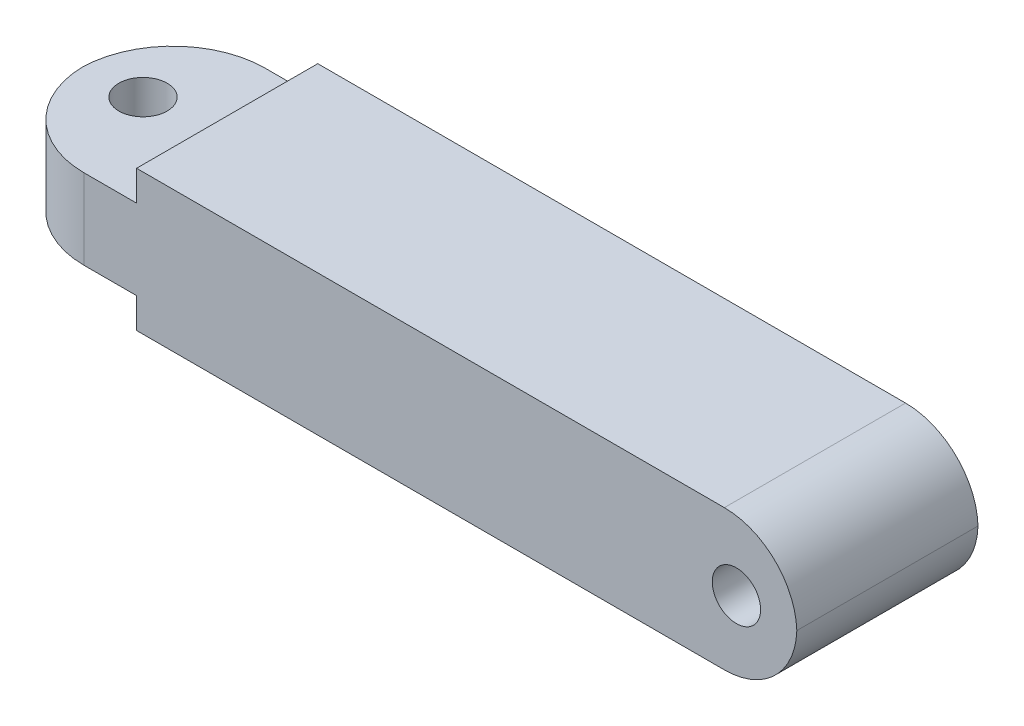
ISO-10303-21;
HEADER;
FILE_DESCRIPTION(('STEP AP214'),'2;1');
FILE_NAME('part.step','',(''),(''),'','','');
FILE_SCHEMA(('AUTOMOTIVE_DESIGN { 1 0 10303 214 1 1 1 1 }'));
ENDSEC;
DATA;
#1=APPLICATION_CONTEXT('core data for automotive mechanical design processes');
#2=APPLICATION_PROTOCOL_DEFINITION('international standard','automotive_design',2000,#1);
#3=PRODUCT_CONTEXT('',#1,'mechanical');
#4=PRODUCT('Part','Part','',(#3));
#5=PRODUCT_RELATED_PRODUCT_CATEGORY('part','',(#4));
#6=PRODUCT_DEFINITION_FORMATION('','',#4);
#7=PRODUCT_DEFINITION_CONTEXT('part definition',#1,'design');
#8=PRODUCT_DEFINITION('design','',#6,#7);
#9=PRODUCT_DEFINITION_SHAPE('','',#8);
#10=(LENGTH_UNIT() NAMED_UNIT(*) SI_UNIT(.MILLI.,.METRE.));
#11=(NAMED_UNIT(*) PLANE_ANGLE_UNIT() SI_UNIT($,.RADIAN.));
#12=(NAMED_UNIT(*) SI_UNIT($,.STERADIAN.) SOLID_ANGLE_UNIT());
#13=UNCERTAINTY_MEASURE_WITH_UNIT(LENGTH_MEASURE(1.E-05),#10,'distance_accuracy_value','');
#14=(GEOMETRIC_REPRESENTATION_CONTEXT(3) GLOBAL_UNCERTAINTY_ASSIGNED_CONTEXT((#13)) GLOBAL_UNIT_ASSIGNED_CONTEXT((#10,
#11,#12)) REPRESENTATION_CONTEXT('',''));
#15=CARTESIAN_POINT('',(0.,0.,0.));
#16=DIRECTION('',(0.,0.,1.));
#17=DIRECTION('',(1.,0.,0.));
#18=AXIS2_PLACEMENT_3D('',#15,#16,#17);
#19=CARTESIAN_POINT('',(-26.9163309618728,5.4095,8.3575723830735));
#20=DIRECTION('',(0.,0.,-1.));
#21=DIRECTION('',(-1.,0.,0.));
#22=AXIS2_PLACEMENT_3D('',#19,#20,#21);
#23=PLANE('',#22);
#24=CARTESIAN_POINT('',(30.4310635687302,0.,8.3575723830735));
#25=DIRECTION('',(0.,0.,1.));
#26=DIRECTION('',(1.,0.,0.));
#27=AXIS2_PLACEMENT_3D('',#24,#25,#26);
#28=CIRCLE('',#27,1.86);
#29=CARTESIAN_POINT('',(32.2910635687302,0.,8.3575723830735));
#30=VERTEX_POINT('',#29);
#31=EDGE_CURVE('E340',#30,#30,#28,.T.);
#32=ORIENTED_EDGE('',*,*,#31,.F.);
#33=EDGE_LOOP('',(#32));
#34=FACE_BOUND('',#33,.T.);
#35=DIRECTION('',(0.,-1.,0.));
#36=VECTOR('',#35,1.);
#37=CARTESIAN_POINT('',(-15.7546459801643,-3.0845,8.3575723830735));
#38=LINE('',#37,#36);
#39=CARTESIAN_POINT('',(-15.7546459801643,-3.0845,8.3575723830735));
#40=VERTEX_POINT('',#39);
#41=CARTESIAN_POINT('',(-15.7546459801643,-5.4095,8.3575723830735));
#42=VERTEX_POINT('',#41);
#43=EDGE_CURVE('E111',#40,#42,#38,.T.);
#44=ORIENTED_EDGE('',*,*,#43,.T.);
#45=DIRECTION('',(1.,0.,0.));
#46=VECTOR('',#45,1.);
#47=CARTESIAN_POINT('',(-26.9163309618728,-5.4095,8.3575723830735));
#48=LINE('',#47,#46);
#49=CARTESIAN_POINT('',(29.5036690381272,-5.4095,8.3575723830735));
#50=VERTEX_POINT('',#49);
#51=EDGE_CURVE('E162',#42,#50,#48,.T.);
#52=ORIENTED_EDGE('',*,*,#51,.T.);
#53=CARTESIAN_POINT('',(29.5036690381272,0.170500000000001,8.3575723830735));
#54=DIRECTION('',(0.,0.,-1.));
#55=DIRECTION('',(-1.,0.,0.));
#56=AXIS2_PLACEMENT_3D('',#53,#54,#55);
#57=CIRCLE('',#56,5.58);
#58=CARTESIAN_POINT('',(35.0810635687302,0.,8.3575723830735));
#59=VERTEX_POINT('',#58);
#60=EDGE_CURVE('E176',#50,#59,#57,.F.);
#61=ORIENTED_EDGE('',*,*,#60,.T.);
#62=CARTESIAN_POINT('',(29.5036690381272,-0.170500000000001,8.3575723830735));
#63=DIRECTION('',(0.,0.,-1.));
#64=DIRECTION('',(-1.,0.,0.));
#65=AXIS2_PLACEMENT_3D('',#62,#63,#64);
#66=CIRCLE('',#65,5.58);
#67=CARTESIAN_POINT('',(29.5036690381272,5.4095,8.3575723830735));
#68=VERTEX_POINT('',#67);
#69=EDGE_CURVE('E173',#59,#68,#66,.F.);
#70=ORIENTED_EDGE('',*,*,#69,.T.);
#71=DIRECTION('',(1.,0.,0.));
#72=VECTOR('',#71,1.);
#73=CARTESIAN_POINT('',(-26.9163309618728,5.4095,8.3575723830735));
#74=LINE('',#73,#72);
#75=CARTESIAN_POINT('',(-15.7546459801643,5.4095,8.3575723830735));
#76=VERTEX_POINT('',#75);
#77=EDGE_CURVE('E155',#76,#68,#74,.T.);
#78=ORIENTED_EDGE('',*,*,#77,.F.);
#79=DIRECTION('',(0.,1.,0.));
#80=VECTOR('',#79,1.);
#81=CARTESIAN_POINT('',(-15.7546459801643,3.0845,8.3575723830735));
#82=LINE('',#81,#80);
#83=CARTESIAN_POINT('',(-15.7546459801643,3.0845,8.3575723830735));
#84=VERTEX_POINT('',#83);
#85=EDGE_CURVE('E148',#84,#76,#82,.T.);
#86=ORIENTED_EDGE('',*,*,#85,.F.);
#87=DIRECTION('',(1.,0.,0.));
#88=VECTOR('',#87,1.);
#89=CARTESIAN_POINT('',(-15.7546459801643,3.0845,8.3575723830735));
#90=LINE('',#89,#88);
#91=CARTESIAN_POINT('',(-19.7863309618728,3.0845,8.3575723830735));
#92=VERTEX_POINT('',#91);
#93=EDGE_CURVE('E144',#92,#84,#90,.T.);
#94=ORIENTED_EDGE('',*,*,#93,.F.);
#95=DIRECTION('',(0.,-1.,0.));
#96=VECTOR('',#95,1.);
#97=CARTESIAN_POINT('',(-19.7863309618728,5.4095,8.3575723830735));
#98=LINE('',#97,#96);
#99=CARTESIAN_POINT('',(-19.7863309618728,-3.0845,8.3575723830735));
#100=VERTEX_POINT('',#99);
#101=EDGE_CURVE('E130',#92,#100,#98,.T.);
#102=ORIENTED_EDGE('',*,*,#101,.T.);
#103=DIRECTION('',(1.,0.,0.));
#104=VECTOR('',#103,1.);
#105=CARTESIAN_POINT('',(-15.7546459801643,-3.0845,8.3575723830735));
#106=LINE('',#105,#104);
#107=EDGE_CURVE('E125',#100,#40,#106,.T.);
#108=ORIENTED_EDGE('',*,*,#107,.T.);
#109=EDGE_LOOP('',(#44,#52,#61,#70,#78,#86,#94,#102,#108));
#110=FACE_BOUND('',#109,.T.);
#111=ADVANCED_FACE('F32',(#34,#110),#23,.F.);
#112=CARTESIAN_POINT('',(-26.9163309618728,5.4095,-5.5924276169265));
#113=DIRECTION('',(0.,0.,1.));
#114=DIRECTION('',(1.,0.,0.));
#115=AXIS2_PLACEMENT_3D('',#112,#113,#114);
#116=PLANE('',#115);
#117=CARTESIAN_POINT('',(30.4310635687302,0.,-5.5924276169265));
#118=DIRECTION('',(0.,0.,1.));
#119=DIRECTION('',(1.,0.,0.));
#120=AXIS2_PLACEMENT_3D('',#117,#118,#119);
#121=CIRCLE('',#120,1.86);
#122=CARTESIAN_POINT('',(32.2910635687302,0.,-5.5924276169265));
#123=VERTEX_POINT('',#122);
#124=EDGE_CURVE('E338',#123,#123,#121,.T.);
#125=ORIENTED_EDGE('',*,*,#124,.T.);
#126=EDGE_LOOP('',(#125));
#127=FACE_BOUND('',#126,.T.);
#128=DIRECTION('',(0.,-1.,0.));
#129=VECTOR('',#128,1.);
#130=CARTESIAN_POINT('',(-15.7546459801643,-3.0845,-5.5924276169265));
#131=LINE('',#130,#129);
#132=CARTESIAN_POINT('',(-15.7546459801643,-3.0845,-5.5924276169265));
#133=VERTEX_POINT('',#132);
#134=CARTESIAN_POINT('',(-15.7546459801643,-5.4095,-5.5924276169265));
#135=VERTEX_POINT('',#134);
#136=EDGE_CURVE('E121',#133,#135,#131,.T.);
#137=ORIENTED_EDGE('',*,*,#136,.F.);
#138=DIRECTION('',(-1.,0.,0.));
#139=VECTOR('',#138,1.);
#140=CARTESIAN_POINT('',(-15.7546459801643,-3.0845,-5.5924276169265));
#141=LINE('',#140,#139);
#142=CARTESIAN_POINT('',(-19.7863309618728,-3.0845,-5.5924276169265));
#143=VERTEX_POINT('',#142);
#144=EDGE_CURVE('E122',#133,#143,#141,.T.);
#145=ORIENTED_EDGE('',*,*,#144,.T.);
#146=DIRECTION('',(0.,-1.,0.));
#147=VECTOR('',#146,1.);
#148=CARTESIAN_POINT('',(-19.7863309618728,5.4095,-5.5924276169265));
#149=LINE('',#148,#147);
#150=CARTESIAN_POINT('',(-19.7863309618728,3.0845,-5.5924276169265));
#151=VERTEX_POINT('',#150);
#152=EDGE_CURVE('E55',#143,#151,#149,.F.);
#153=ORIENTED_EDGE('',*,*,#152,.T.);
#154=DIRECTION('',(-1.,0.,0.));
#155=VECTOR('',#154,1.);
#156=CARTESIAN_POINT('',(-15.7546459801643,3.0845,-5.5924276169265));
#157=LINE('',#156,#155);
#158=CARTESIAN_POINT('',(-15.7546459801643,3.0845,-5.5924276169265));
#159=VERTEX_POINT('',#158);
#160=EDGE_CURVE('E142',#159,#151,#157,.T.);
#161=ORIENTED_EDGE('',*,*,#160,.F.);
#162=DIRECTION('',(0.,1.,0.));
#163=VECTOR('',#162,1.);
#164=CARTESIAN_POINT('',(-15.7546459801643,3.0845,-5.5924276169265));
#165=LINE('',#164,#163);
#166=CARTESIAN_POINT('',(-15.7546459801643,5.4095,-5.5924276169265));
#167=VERTEX_POINT('',#166);
#168=EDGE_CURVE('E146',#159,#167,#165,.T.);
#169=ORIENTED_EDGE('',*,*,#168,.T.);
#170=DIRECTION('',(-1.,0.,0.));
#171=VECTOR('',#170,1.);
#172=CARTESIAN_POINT('',(-26.9163309618728,5.4095,-5.5924276169265));
#173=LINE('',#172,#171);
#174=CARTESIAN_POINT('',(29.5036690381272,5.4095,-5.5924276169265));
#175=VERTEX_POINT('',#174);
#176=EDGE_CURVE('E157',#175,#167,#173,.T.);
#177=ORIENTED_EDGE('',*,*,#176,.F.);
#178=CARTESIAN_POINT('',(29.5036690381272,-0.170500000000001,-5.5924276169265));
#179=DIRECTION('',(0.,0.,1.));
#180=DIRECTION('',(1.,0.,0.));
#181=AXIS2_PLACEMENT_3D('',#178,#179,#180);
#182=CIRCLE('',#181,5.58);
#183=CARTESIAN_POINT('',(35.0810635687302,0.,-5.5924276169265));
#184=VERTEX_POINT('',#183);
#185=EDGE_CURVE('E161',#175,#184,#182,.F.);
#186=ORIENTED_EDGE('',*,*,#185,.T.);
#187=CARTESIAN_POINT('',(29.5036690381272,0.170500000000001,-5.5924276169265));
#188=DIRECTION('',(0.,0.,1.));
#189=DIRECTION('',(1.,0.,0.));
#190=AXIS2_PLACEMENT_3D('',#187,#188,#189);
#191=CIRCLE('',#190,5.58);
#192=CARTESIAN_POINT('',(29.5036690381272,-5.4095,-5.5924276169265));
#193=VERTEX_POINT('',#192);
#194=EDGE_CURVE('E168',#184,#193,#191,.F.);
#195=ORIENTED_EDGE('',*,*,#194,.T.);
#196=DIRECTION('',(-1.,0.,0.));
#197=VECTOR('',#196,1.);
#198=CARTESIAN_POINT('',(-26.9163309618728,-5.4095,-5.5924276169265));
#199=LINE('',#198,#197);
#200=EDGE_CURVE('E158',#193,#135,#199,.T.);
#201=ORIENTED_EDGE('',*,*,#200,.T.);
#202=EDGE_LOOP('',(#137,#145,#153,#161,#169,#177,#186,#195,#201));
#203=FACE_BOUND('',#202,.T.);
#204=ADVANCED_FACE('F194',(#127,#203),#116,.F.);
#205=CARTESIAN_POINT('',(0.,-5.4095,0.));
#206=DIRECTION('',(0.,1.,0.));
#207=DIRECTION('',(0.,0.,1.));
#208=AXIS2_PLACEMENT_3D('',#205,#206,#207);
#209=PLANE('',#208);
#210=DIRECTION('',(0.,0.,-1.));
#211=VECTOR('',#210,1.);
#212=CARTESIAN_POINT('',(-15.7546459801643,-5.4095,-5.5924276169265));
#213=LINE('',#212,#211);
#214=EDGE_CURVE('E117',#42,#135,#213,.T.);
#215=ORIENTED_EDGE('',*,*,#214,.T.);
#216=ORIENTED_EDGE('',*,*,#200,.F.);
#217=DIRECTION('',(0.,0.,-1.));
#218=VECTOR('',#217,1.);
#219=CARTESIAN_POINT('',(29.5036690381272,-5.4095,0.));
#220=LINE('',#219,#218);
#221=EDGE_CURVE('E170',#193,#50,#220,.F.);
#222=ORIENTED_EDGE('',*,*,#221,.T.);
#223=ORIENTED_EDGE('',*,*,#51,.F.);
#224=EDGE_LOOP('',(#215,#216,#222,#223));
#225=FACE_BOUND('',#224,.T.);
#226=ADVANCED_FACE('F197',(#225),#209,.F.);
#227=CARTESIAN_POINT('',(0.,5.4095,0.));
#228=DIRECTION('',(0.,1.,0.));
#229=DIRECTION('',(0.,0.,1.));
#230=AXIS2_PLACEMENT_3D('',#227,#228,#229);
#231=PLANE('',#230);
#232=DIRECTION('',(0.,0.,-1.));
#233=VECTOR('',#232,1.);
#234=CARTESIAN_POINT('',(-15.7546459801643,5.4095,-5.5924276169265));
#235=LINE('',#234,#233);
#236=EDGE_CURVE('E138',#76,#167,#235,.T.);
#237=ORIENTED_EDGE('',*,*,#236,.F.);
#238=ORIENTED_EDGE('',*,*,#77,.T.);
#239=DIRECTION('',(0.,0.,-1.));
#240=VECTOR('',#239,1.);
#241=CARTESIAN_POINT('',(29.5036690381272,5.4095,-5.5924276169265));
#242=LINE('',#241,#240);
#243=EDGE_CURVE('E178',#68,#175,#242,.T.);
#244=ORIENTED_EDGE('',*,*,#243,.T.);
#245=ORIENTED_EDGE('',*,*,#176,.T.);
#246=EDGE_LOOP('',(#237,#238,#244,#245));
#247=FACE_BOUND('',#246,.T.);
#248=ADVANCED_FACE('F213',(#247),#231,.T.);
#249=CARTESIAN_POINT('',(29.5036690381272,-0.170500000000001,0.));
#250=DIRECTION('',(0.,0.,1.));
#251=DIRECTION('',(1.,0.,0.));
#252=AXIS2_PLACEMENT_3D('',#249,#250,#251);
#253=CYLINDRICAL_SURFACE('',#252,5.58);
#254=ORIENTED_EDGE('',*,*,#243,.F.);
#255=ORIENTED_EDGE('',*,*,#69,.F.);
#256=DIRECTION('',(0.,0.,1.));
#257=VECTOR('',#256,1.);
#258=CARTESIAN_POINT('',(35.0810635687302,0.,1.3825723830735));
#259=LINE('',#258,#257);
#260=EDGE_CURVE('E164',#184,#59,#259,.T.);
#261=ORIENTED_EDGE('',*,*,#260,.F.);
#262=ORIENTED_EDGE('',*,*,#185,.F.);
#263=EDGE_LOOP('',(#254,#255,#261,#262));
#264=FACE_BOUND('',#263,.T.);
#265=ADVANCED_FACE('F208',(#264),#253,.T.);
#266=CARTESIAN_POINT('',(29.5036690381272,0.170500000000001,-5.5924276169265));
#267=DIRECTION('',(0.,0.,-1.));
#268=DIRECTION('',(-1.,0.,0.));
#269=AXIS2_PLACEMENT_3D('',#266,#267,#268);
#270=CYLINDRICAL_SURFACE('',#269,5.58);
#271=ORIENTED_EDGE('',*,*,#60,.F.);
#272=ORIENTED_EDGE('',*,*,#221,.F.);
#273=ORIENTED_EDGE('',*,*,#194,.F.);
#274=ORIENTED_EDGE('',*,*,#260,.T.);
#275=EDGE_LOOP('',(#271,#272,#273,#274));
#276=FACE_BOUND('',#275,.T.);
#277=ADVANCED_FACE('F202',(#276),#270,.T.);
#278=CARTESIAN_POINT('',(-19.7863309618728,5.4095,1.2275723830735));
#279=DIRECTION('',(0.,-1.,0.));
#280=DIRECTION('',(0.,0.,-1.));
#281=AXIS2_PLACEMENT_3D('',#278,#279,#280);
#282=CYLINDRICAL_SURFACE('',#281,7.13);
#283=CARTESIAN_POINT('',(-19.7863309618728,-3.0845,1.2275723830735));
#284=DIRECTION('',(0.,1.,0.));
#285=DIRECTION('',(0.,0.,1.));
#286=AXIS2_PLACEMENT_3D('',#283,#284,#285);
#287=CIRCLE('',#286,7.13);
#288=CARTESIAN_POINT('',(-26.9146459801643,-3.0845,1.3825723830734));
#289=VERTEX_POINT('',#288);
#290=EDGE_CURVE('E47',#100,#289,#287,.F.);
#291=ORIENTED_EDGE('',*,*,#290,.F.);
#292=ORIENTED_EDGE('',*,*,#101,.F.);
#293=CARTESIAN_POINT('',(-19.7863309618728,3.0845,1.2275723830735));
#294=DIRECTION('',(0.,-1.,0.));
#295=DIRECTION('',(0.,0.,-1.));
#296=AXIS2_PLACEMENT_3D('',#293,#294,#295);
#297=CIRCLE('',#296,7.13);
#298=CARTESIAN_POINT('',(-26.9146459801643,3.0845,1.3825723830734));
#299=VERTEX_POINT('',#298);
#300=EDGE_CURVE('E150',#299,#92,#297,.F.);
#301=ORIENTED_EDGE('',*,*,#300,.F.);
#302=DIRECTION('',(0.,-1.,0.));
#303=VECTOR('',#302,1.);
#304=CARTESIAN_POINT('',(-26.9146459801643,0.,1.3825723830734));
#305=LINE('',#304,#303);
#306=EDGE_CURVE('E154',#289,#299,#305,.F.);
#307=ORIENTED_EDGE('',*,*,#306,.F.);
#308=EDGE_LOOP('',(#291,#292,#301,#307));
#309=FACE_BOUND('',#308,.T.);
#310=ADVANCED_FACE('F34',(#309),#282,.T.);
#311=CARTESIAN_POINT('',(-19.7863309618728,5.4095,1.5375723830735));
#312=DIRECTION('',(0.,-1.,0.));
#313=DIRECTION('',(0.,0.,-1.));
#314=AXIS2_PLACEMENT_3D('',#311,#312,#313);
#315=CYLINDRICAL_SURFACE('',#314,7.13);
#316=CARTESIAN_POINT('',(-19.7863309618728,-3.0845,1.5375723830735));
#317=DIRECTION('',(0.,1.,0.));
#318=DIRECTION('',(0.,0.,1.));
#319=AXIS2_PLACEMENT_3D('',#316,#317,#318);
#320=CIRCLE('',#319,7.13);
#321=EDGE_CURVE('E11',#289,#143,#320,.F.);
#322=ORIENTED_EDGE('',*,*,#321,.F.);
#323=ORIENTED_EDGE('',*,*,#306,.T.);
#324=CARTESIAN_POINT('',(-19.7863309618728,3.0845,1.5375723830735));
#325=DIRECTION('',(0.,-1.,0.));
#326=DIRECTION('',(0.,0.,-1.));
#327=AXIS2_PLACEMENT_3D('',#324,#325,#326);
#328=CIRCLE('',#327,7.13);
#329=EDGE_CURVE('E41',#151,#299,#328,.F.);
#330=ORIENTED_EDGE('',*,*,#329,.F.);
#331=ORIENTED_EDGE('',*,*,#152,.F.);
#332=EDGE_LOOP('',(#322,#323,#330,#331));
#333=FACE_BOUND('',#332,.T.);
#334=ADVANCED_FACE('F193',(#333),#315,.T.);
#335=CARTESIAN_POINT('',(-15.7546459801643,3.0845,-5.5924276169265));
#336=DIRECTION('',(1.,0.,0.));
#337=DIRECTION('',(0.,0.,-1.));
#338=AXIS2_PLACEMENT_3D('',#335,#336,#337);
#339=PLANE('',#338);
#340=ORIENTED_EDGE('',*,*,#236,.T.);
#341=ORIENTED_EDGE('',*,*,#168,.F.);
#342=DIRECTION('',(0.,0.,-1.));
#343=VECTOR('',#342,1.);
#344=CARTESIAN_POINT('',(-15.7546459801643,3.0845,-5.5924276169265));
#345=LINE('',#344,#343);
#346=EDGE_CURVE('E139',#84,#159,#345,.T.);
#347=ORIENTED_EDGE('',*,*,#346,.F.);
#348=ORIENTED_EDGE('',*,*,#85,.T.);
#349=EDGE_LOOP('',(#340,#341,#347,#348));
#350=FACE_BOUND('',#349,.T.);
#351=ADVANCED_FACE('F216',(#350),#339,.F.);
#352=CARTESIAN_POINT('',(0.,3.0845,0.));
#353=DIRECTION('',(0.,-1.,0.));
#354=DIRECTION('',(0.,0.,-1.));
#355=AXIS2_PLACEMENT_3D('',#352,#353,#354);
#356=PLANE('',#355);
#357=CARTESIAN_POINT('',(-22.5746459801643,3.0845,1.04048220019917));
#358=DIRECTION('',(0.,1.,0.));
#359=DIRECTION('',(0.,0.,1.));
#360=AXIS2_PLACEMENT_3D('',#357,#358,#359);
#361=CIRCLE('',#360,1.86);
#362=CARTESIAN_POINT('',(-22.5746459801643,3.0845,2.90048220019917));
#363=VERTEX_POINT('',#362);
#364=EDGE_CURVE('E342',#363,#363,#361,.T.);
#365=ORIENTED_EDGE('',*,*,#364,.F.);
#366=EDGE_LOOP('',(#365));
#367=FACE_BOUND('',#366,.T.);
#368=ORIENTED_EDGE('',*,*,#300,.T.);
#369=ORIENTED_EDGE('',*,*,#93,.T.);
#370=ORIENTED_EDGE('',*,*,#346,.T.);
#371=ORIENTED_EDGE('',*,*,#160,.T.);
#372=ORIENTED_EDGE('',*,*,#329,.T.);
#373=EDGE_LOOP('',(#368,#369,#370,#371,#372));
#374=FACE_BOUND('',#373,.T.);
#375=ADVANCED_FACE('F189',(#367,#374),#356,.F.);
#376=CARTESIAN_POINT('',(-15.7546459801643,-3.0845,-5.5924276169265));
#377=DIRECTION('',(-1.,0.,0.));
#378=DIRECTION('',(0.,0.,1.));
#379=AXIS2_PLACEMENT_3D('',#376,#377,#378);
#380=PLANE('',#379);
#381=ORIENTED_EDGE('',*,*,#214,.F.);
#382=ORIENTED_EDGE('',*,*,#43,.F.);
#383=DIRECTION('',(0.,0.,-1.));
#384=VECTOR('',#383,1.);
#385=CARTESIAN_POINT('',(-15.7546459801643,-3.0845,-5.5924276169265));
#386=LINE('',#385,#384);
#387=EDGE_CURVE('E114',#40,#133,#386,.T.);
#388=ORIENTED_EDGE('',*,*,#387,.T.);
#389=ORIENTED_EDGE('',*,*,#136,.T.);
#390=EDGE_LOOP('',(#381,#382,#388,#389));
#391=FACE_BOUND('',#390,.T.);
#392=ADVANCED_FACE('F113',(#391),#380,.T.);
#393=CARTESIAN_POINT('',(0.,-3.0845,0.));
#394=DIRECTION('',(0.,1.,0.));
#395=DIRECTION('',(0.,0.,-1.));
#396=AXIS2_PLACEMENT_3D('',#393,#394,#395);
#397=PLANE('',#396);
#398=CARTESIAN_POINT('',(-22.5746459801643,-3.0845,1.04048220019917));
#399=DIRECTION('',(0.,1.,0.));
#400=DIRECTION('',(0.,0.,1.));
#401=AXIS2_PLACEMENT_3D('',#398,#399,#400);
#402=CIRCLE('',#401,1.86);
#403=CARTESIAN_POINT('',(-22.5746459801643,-3.0845,2.90048220019917));
#404=VERTEX_POINT('',#403);
#405=EDGE_CURVE('E36',#404,#404,#402,.T.);
#406=ORIENTED_EDGE('',*,*,#405,.T.);
#407=EDGE_LOOP('',(#406));
#408=FACE_BOUND('',#407,.T.);
#409=ORIENTED_EDGE('',*,*,#290,.T.);
#410=ORIENTED_EDGE('',*,*,#321,.T.);
#411=ORIENTED_EDGE('',*,*,#144,.F.);
#412=ORIENTED_EDGE('',*,*,#387,.F.);
#413=ORIENTED_EDGE('',*,*,#107,.F.);
#414=EDGE_LOOP('',(#409,#410,#411,#412,#413));
#415=FACE_BOUND('',#414,.T.);
#416=ADVANCED_FACE('F124',(#408,#415),#397,.F.);
#417=CARTESIAN_POINT('',(-22.5746459801643,-5.4095,1.04048220019917));
#418=DIRECTION('',(0.,1.,0.));
#419=DIRECTION('',(0.,0.,1.));
#420=AXIS2_PLACEMENT_3D('',#417,#418,#419);
#421=CYLINDRICAL_SURFACE('',#420,1.86);
#422=ORIENTED_EDGE('',*,*,#364,.T.);
#423=EDGE_LOOP('',(#422));
#424=FACE_BOUND('',#423,.T.);
#425=ORIENTED_EDGE('',*,*,#405,.F.);
#426=EDGE_LOOP('',(#425));
#427=FACE_BOUND('',#426,.T.);
#428=ADVANCED_FACE('F310',(#424,#427),#421,.F.);
#429=CARTESIAN_POINT('',(30.4310635687302,0.,-5.5924276169265));
#430=DIRECTION('',(0.,0.,1.));
#431=DIRECTION('',(1.,0.,0.));
#432=AXIS2_PLACEMENT_3D('',#429,#430,#431);
#433=CYLINDRICAL_SURFACE('',#432,1.86);
#434=CARTESIAN_POINT('',(32.2910635687302,0.,-5.5924276169265));
#435=CARTESIAN_POINT('',(32.2910635687302,0.,-5.4471151169265));
#436=CARTESIAN_POINT('',(32.2910635687302,0.,-5.3018026169265));
#437=CARTESIAN_POINT('',(32.2910635687302,0.,-5.0111776169265));
#438=CARTESIAN_POINT('',(32.2910635687302,0.,-4.8658651169265));
#439=CARTESIAN_POINT('',(32.2910635687302,0.,-4.5752401169265));
#440=CARTESIAN_POINT('',(32.2910635687302,0.,-4.4299276169265));
#441=CARTESIAN_POINT('',(32.2910635687302,0.,-4.1393026169265));
#442=CARTESIAN_POINT('',(32.2910635687302,0.,-3.9939901169265));
#443=CARTESIAN_POINT('',(32.2910635687302,0.,-3.7033651169265));
#444=CARTESIAN_POINT('',(32.2910635687302,0.,-3.5580526169265));
#445=CARTESIAN_POINT('',(32.2910635687302,0.,-3.2674276169265));
#446=CARTESIAN_POINT('',(32.2910635687302,0.,-3.1221151169265));
#447=CARTESIAN_POINT('',(32.2910635687302,0.,-2.8314901169265));
#448=CARTESIAN_POINT('',(32.2910635687302,0.,-2.6861776169265));
#449=CARTESIAN_POINT('',(32.2910635687302,0.,-2.3955526169265));
#450=CARTESIAN_POINT('',(32.2910635687302,0.,-2.2502401169265));
#451=CARTESIAN_POINT('',(32.2910635687302,0.,-1.9596151169265));
#452=CARTESIAN_POINT('',(32.2910635687302,0.,-1.8143026169265));
#453=CARTESIAN_POINT('',(32.2910635687302,0.,-1.5236776169265));
#454=CARTESIAN_POINT('',(32.2910635687302,0.,-1.3783651169265));
#455=CARTESIAN_POINT('',(32.2910635687302,0.,-1.0877401169265));
#456=CARTESIAN_POINT('',(32.2910635687302,0.,-0.942427616926502));
#457=CARTESIAN_POINT('',(32.2910635687302,0.,-0.651802616926502));
#458=CARTESIAN_POINT('',(32.2910635687302,0.,-0.506490116926502));
#459=CARTESIAN_POINT('',(32.2910635687302,0.,-0.215865116926502));
#460=CARTESIAN_POINT('',(32.2910635687302,0.,-0.0705526169265015));
#461=CARTESIAN_POINT('',(32.2910635687302,0.,0.220072383073499));
#462=CARTESIAN_POINT('',(32.2910635687302,0.,0.365384883073498));
#463=CARTESIAN_POINT('',(32.2910635687302,0.,0.656009883073499));
#464=CARTESIAN_POINT('',(32.2910635687302,0.,0.801322383073499));
#465=CARTESIAN_POINT('',(32.2910635687302,0.,1.0919473830735));
#466=CARTESIAN_POINT('',(32.2910635687302,0.,1.2372598830735));
#467=CARTESIAN_POINT('',(32.2910635687302,0.,1.5278848830735));
#468=CARTESIAN_POINT('',(32.2910635687302,0.,1.6731973830735));
#469=CARTESIAN_POINT('',(32.2910635687302,0.,1.9638223830735));
#470=CARTESIAN_POINT('',(32.2910635687302,0.,2.1091348830735));
#471=CARTESIAN_POINT('',(32.2910635687302,0.,2.3997598830735));
#472=CARTESIAN_POINT('',(32.2910635687302,0.,2.5450723830735));
#473=CARTESIAN_POINT('',(32.2910635687302,0.,2.8356973830735));
#474=CARTESIAN_POINT('',(32.2910635687302,0.,2.9810098830735));
#475=CARTESIAN_POINT('',(32.2910635687302,0.,3.2716348830735));
#476=CARTESIAN_POINT('',(32.2910635687302,0.,3.4169473830735));
#477=CARTESIAN_POINT('',(32.2910635687302,0.,3.7075723830735));
#478=CARTESIAN_POINT('',(32.2910635687302,0.,3.8528848830735));
#479=CARTESIAN_POINT('',(32.2910635687302,0.,4.1435098830735));
#480=CARTESIAN_POINT('',(32.2910635687302,0.,4.2888223830735));
#481=CARTESIAN_POINT('',(32.2910635687302,0.,4.5794473830735));
#482=CARTESIAN_POINT('',(32.2910635687302,0.,4.7247598830735));
#483=CARTESIAN_POINT('',(32.2910635687302,0.,5.0153848830735));
#484=CARTESIAN_POINT('',(32.2910635687302,0.,5.1606973830735));
#485=CARTESIAN_POINT('',(32.2910635687302,0.,5.4513223830735));
#486=CARTESIAN_POINT('',(32.2910635687302,0.,5.5966348830735));
#487=CARTESIAN_POINT('',(32.2910635687302,0.,5.8872598830735));
#488=CARTESIAN_POINT('',(32.2910635687302,0.,6.0325723830735));
#489=CARTESIAN_POINT('',(32.2910635687302,0.,6.3231973830735));
#490=CARTESIAN_POINT('',(32.2910635687302,0.,6.4685098830735));
#491=CARTESIAN_POINT('',(32.2910635687302,0.,6.7591348830735));
#492=CARTESIAN_POINT('',(32.2910635687302,0.,6.9044473830735));
#493=CARTESIAN_POINT('',(32.2910635687302,0.,7.1950723830735));
#494=CARTESIAN_POINT('',(32.2910635687302,0.,7.3403848830735));
#495=CARTESIAN_POINT('',(32.2910635687302,0.,7.6310098830735));
#496=CARTESIAN_POINT('',(32.2910635687302,0.,7.7763223830735));
#497=CARTESIAN_POINT('',(32.2910635687302,0.,8.0669473830735));
#498=CARTESIAN_POINT('',(32.2910635687302,0.,8.2122598830735));
#499=CARTESIAN_POINT('',(32.2910635687302,0.,8.3575723830735));
#500=B_SPLINE_CURVE_WITH_KNOTS('',3,(#434,#435,#436,#437,#438,#439,#440,#441,#442,#443,#444,
#445,#446,#447,#448,#449,#450,#451,#452,#453,#454,#455,#456,#457,#458,#459,#460,#461,#462,#463,
#464,#465,#466,#467,#468,#469,#470,#471,#472,#473,#474,#475,#476,#477,#478,#479,#480,#481,#482,
#483,#484,#485,#486,#487,#488,#489,#490,#491,#492,#493,#494,#495,#496,#497,#498,#499),
.UNSPECIFIED.,.F.,.F.,(4,2,2,2,2,2,2,2,2,2,2,2,2,2,2,2,2,2,2,2,2,2,2,2,2,2,2,2,2,2,2,2,4),(0.,
0.435937500000001,0.871875,1.3078125,1.74375,2.1796875,2.615625,3.0515625,3.4875,3.9234375,
4.359375,4.7953125,5.23125,5.6671875,6.103125,6.5390625,6.975,7.4109375,7.846875,8.2828125,
8.71875,9.1546875,9.590625,10.0265625,10.4625,10.8984375,11.334375,11.7703125,12.20625,
12.6421875,13.078125,13.5140625,13.95),.UNSPECIFIED.);
#501=EDGE_CURVE('BSEAM319',#123,#30,#500,.T.);
#502=ORIENTED_EDGE('',*,*,#124,.F.);
#503=ORIENTED_EDGE('',*,*,#31,.T.);
#504=ORIENTED_EDGE('',*,*,#501,.T.);
#505=ORIENTED_EDGE('',*,*,#501,.F.);
#506=EDGE_LOOP('',(#502,#504,#503,#505));
#507=FACE_BOUND('',#506,.T.);
#508=ADVANCED_FACE('F319',(#507),#433,.F.);
#509=CLOSED_SHELL('',(#111,#204,#226,#248,#265,#277,#310,#334,#351,#375,#392,#416,#428,#508));
#510=MANIFOLD_SOLID_BREP('B2',#509);
#511=ADVANCED_BREP_SHAPE_REPRESENTATION('',(#18,#510),#14);
#512=SHAPE_DEFINITION_REPRESENTATION(#9,#511);
ENDSEC;
END-ISO-10303-21;
